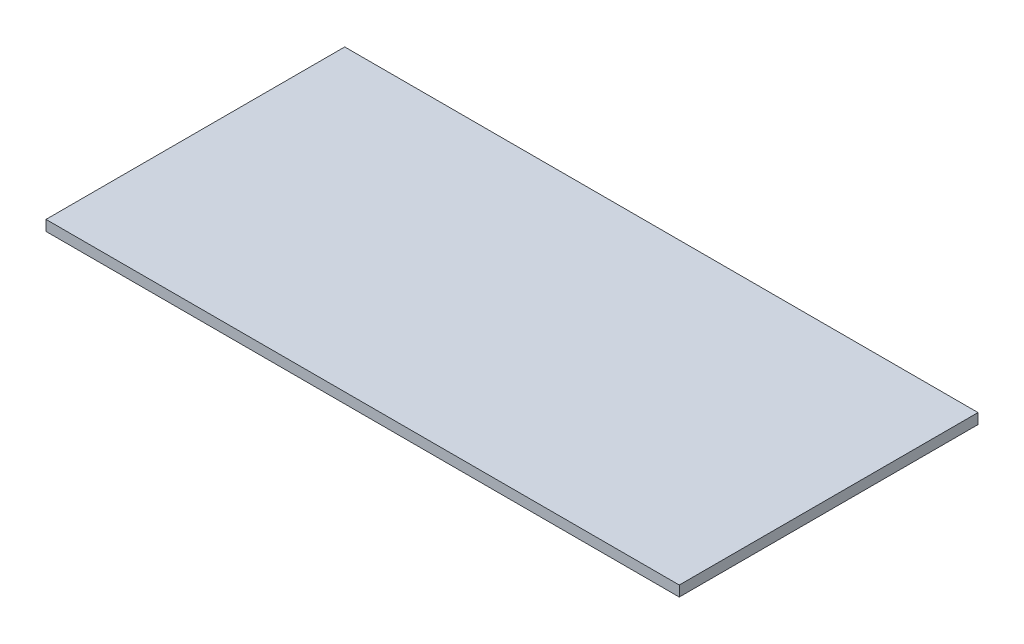
ISO-10303-21;
HEADER;
FILE_DESCRIPTION(('STEP AP214'),'2;1');
FILE_NAME('part.step','',(''),(''),'','','');
FILE_SCHEMA(('AUTOMOTIVE_DESIGN { 1 0 10303 214 1 1 1 1 }'));
ENDSEC;
DATA;
#1=APPLICATION_CONTEXT('core data for automotive mechanical design processes');
#2=APPLICATION_PROTOCOL_DEFINITION('international standard','automotive_design',2000,#1);
#3=PRODUCT_CONTEXT('',#1,'mechanical');
#4=PRODUCT('Part','Part','',(#3));
#5=PRODUCT_RELATED_PRODUCT_CATEGORY('part','',(#4));
#6=PRODUCT_DEFINITION_FORMATION('','',#4);
#7=PRODUCT_DEFINITION_CONTEXT('part definition',#1,'design');
#8=PRODUCT_DEFINITION('design','',#6,#7);
#9=PRODUCT_DEFINITION_SHAPE('','',#8);
#10=(LENGTH_UNIT() NAMED_UNIT(*) SI_UNIT(.MILLI.,.METRE.));
#11=(NAMED_UNIT(*) PLANE_ANGLE_UNIT() SI_UNIT($,.RADIAN.));
#12=(NAMED_UNIT(*) SI_UNIT($,.STERADIAN.) SOLID_ANGLE_UNIT());
#13=UNCERTAINTY_MEASURE_WITH_UNIT(LENGTH_MEASURE(1.E-05),#10,'distance_accuracy_value','');
#14=(GEOMETRIC_REPRESENTATION_CONTEXT(3) GLOBAL_UNCERTAINTY_ASSIGNED_CONTEXT((#13)) GLOBAL_UNIT_ASSIGNED_CONTEXT((#10,
#11,#12)) REPRESENTATION_CONTEXT('',''));
#15=CARTESIAN_POINT('',(0.,0.,0.));
#16=DIRECTION('',(0.,0.,1.));
#17=DIRECTION('',(1.,0.,0.));
#18=AXIS2_PLACEMENT_3D('',#15,#16,#17);
#19=CARTESIAN_POINT('',(-34.0725915138242,3.5,74.9306891112476));
#20=DIRECTION('',(1.,0.,0.));
#21=DIRECTION('',(0.,0.,-1.));
#22=AXIS2_PLACEMENT_3D('',#19,#20,#21);
#23=PLANE('',#22);
#24=DIRECTION('',(0.,0.,1.));
#25=VECTOR('',#24,1.);
#26=CARTESIAN_POINT('',(-34.0725915138242,0.,74.9306891112476));
#27=LINE('',#26,#25);
#28=CARTESIAN_POINT('',(-34.0725915138242,0.,-25.0693108887524));
#29=VERTEX_POINT('',#28);
#30=CARTESIAN_POINT('',(-34.0725915138242,0.,74.9306891112476));
#31=VERTEX_POINT('',#30);
#32=EDGE_CURVE('E111',#29,#31,#27,.T.);
#33=ORIENTED_EDGE('',*,*,#32,.T.);
#34=DIRECTION('',(0.,-1.,0.));
#35=VECTOR('',#34,1.);
#36=CARTESIAN_POINT('',(-34.0725915138242,3.5,74.9306891112476));
#37=LINE('',#36,#35);
#38=CARTESIAN_POINT('',(-34.0725915138242,3.5,74.9306891112476));
#39=VERTEX_POINT('',#38);
#40=EDGE_CURVE('E11',#39,#31,#37,.T.);
#41=ORIENTED_EDGE('',*,*,#40,.F.);
#42=DIRECTION('',(0.,0.,1.));
#43=VECTOR('',#42,1.);
#44=CARTESIAN_POINT('',(-34.0725915138242,3.5,74.9306891112476));
#45=LINE('',#44,#43);
#46=CARTESIAN_POINT('',(-34.0725915138242,3.5,-25.0693108887524));
#47=VERTEX_POINT('',#46);
#48=EDGE_CURVE('E95',#47,#39,#45,.T.);
#49=ORIENTED_EDGE('',*,*,#48,.F.);
#50=DIRECTION('',(0.,-1.,0.));
#51=VECTOR('',#50,1.);
#52=CARTESIAN_POINT('',(-34.0725915138242,3.5,-25.0693108887524));
#53=LINE('',#52,#51);
#54=EDGE_CURVE('E107',#47,#29,#53,.T.);
#55=ORIENTED_EDGE('',*,*,#54,.T.);
#56=EDGE_LOOP('',(#33,#41,#49,#55));
#57=FACE_BOUND('',#56,.T.);
#58=ADVANCED_FACE('F43',(#57),#23,.F.);
#59=CARTESIAN_POINT('',(177.927408486176,3.5,74.9306891112475));
#60=DIRECTION('',(0.,0.,-1.));
#61=DIRECTION('',(-1.,0.,0.));
#62=AXIS2_PLACEMENT_3D('',#59,#60,#61);
#63=PLANE('',#62);
#64=DIRECTION('',(1.,0.,0.));
#65=VECTOR('',#64,1.);
#66=CARTESIAN_POINT('',(177.927408486176,0.,74.9306891112475));
#67=LINE('',#66,#65);
#68=CARTESIAN_POINT('',(177.927408486176,0.,74.9306891112475));
#69=VERTEX_POINT('',#68);
#70=EDGE_CURVE('E100',#31,#69,#67,.T.);
#71=ORIENTED_EDGE('',*,*,#70,.T.);
#72=DIRECTION('',(0.,-1.,0.));
#73=VECTOR('',#72,1.);
#74=CARTESIAN_POINT('',(177.927408486176,3.5,74.9306891112475));
#75=LINE('',#74,#73);
#76=CARTESIAN_POINT('',(177.927408486176,3.5,74.9306891112475));
#77=VERTEX_POINT('',#76);
#78=EDGE_CURVE('E52',#77,#69,#75,.T.);
#79=ORIENTED_EDGE('',*,*,#78,.F.);
#80=DIRECTION('',(1.,0.,0.));
#81=VECTOR('',#80,1.);
#82=CARTESIAN_POINT('',(177.927408486176,3.5,74.9306891112475));
#83=LINE('',#82,#81);
#84=EDGE_CURVE('E90',#39,#77,#83,.T.);
#85=ORIENTED_EDGE('',*,*,#84,.F.);
#86=ORIENTED_EDGE('',*,*,#40,.T.);
#87=EDGE_LOOP('',(#71,#79,#85,#86));
#88=FACE_BOUND('',#87,.T.);
#89=ADVANCED_FACE('F99',(#88),#63,.F.);
#90=CARTESIAN_POINT('',(177.927408486176,3.5,-25.0693108887524));
#91=DIRECTION('',(-1.,0.,0.));
#92=DIRECTION('',(0.,0.,1.));
#93=AXIS2_PLACEMENT_3D('',#90,#91,#92);
#94=PLANE('',#93);
#95=DIRECTION('',(0.,0.,-1.));
#96=VECTOR('',#95,1.);
#97=CARTESIAN_POINT('',(177.927408486176,0.,-25.0693108887524));
#98=LINE('',#97,#96);
#99=CARTESIAN_POINT('',(177.927408486176,0.,-25.0693108887524));
#100=VERTEX_POINT('',#99);
#101=EDGE_CURVE('E77',#69,#100,#98,.T.);
#102=ORIENTED_EDGE('',*,*,#101,.T.);
#103=DIRECTION('',(0.,-1.,0.));
#104=VECTOR('',#103,1.);
#105=CARTESIAN_POINT('',(177.927408486176,3.5,-25.0693108887524));
#106=LINE('',#105,#104);
#107=CARTESIAN_POINT('',(177.927408486176,3.5,-25.0693108887524));
#108=VERTEX_POINT('',#107);
#109=EDGE_CURVE('E102',#108,#100,#106,.T.);
#110=ORIENTED_EDGE('',*,*,#109,.F.);
#111=DIRECTION('',(0.,0.,-1.));
#112=VECTOR('',#111,1.);
#113=CARTESIAN_POINT('',(177.927408486176,3.5,-25.0693108887524));
#114=LINE('',#113,#112);
#115=EDGE_CURVE('E93',#77,#108,#114,.T.);
#116=ORIENTED_EDGE('',*,*,#115,.F.);
#117=ORIENTED_EDGE('',*,*,#78,.T.);
#118=EDGE_LOOP('',(#102,#110,#116,#117));
#119=FACE_BOUND('',#118,.T.);
#120=ADVANCED_FACE('F103',(#119),#94,.F.);
#121=CARTESIAN_POINT('',(-34.0725915138242,3.5,-25.0693108887524));
#122=DIRECTION('',(0.,0.,1.));
#123=DIRECTION('',(1.,0.,0.));
#124=AXIS2_PLACEMENT_3D('',#121,#122,#123);
#125=PLANE('',#124);
#126=DIRECTION('',(-1.,0.,0.));
#127=VECTOR('',#126,1.);
#128=CARTESIAN_POINT('',(-34.0725915138242,0.,-25.0693108887524));
#129=LINE('',#128,#127);
#130=EDGE_CURVE('E83',#100,#29,#129,.T.);
#131=ORIENTED_EDGE('',*,*,#130,.T.);
#132=ORIENTED_EDGE('',*,*,#54,.F.);
#133=DIRECTION('',(-1.,0.,0.));
#134=VECTOR('',#133,1.);
#135=CARTESIAN_POINT('',(-34.0725915138242,3.5,-25.0693108887524));
#136=LINE('',#135,#134);
#137=EDGE_CURVE('E60',#108,#47,#136,.T.);
#138=ORIENTED_EDGE('',*,*,#137,.F.);
#139=ORIENTED_EDGE('',*,*,#109,.T.);
#140=EDGE_LOOP('',(#131,#132,#138,#139));
#141=FACE_BOUND('',#140,.T.);
#142=ADVANCED_FACE('F124',(#141),#125,.F.);
#143=CARTESIAN_POINT('',(0.,3.5,0.));
#144=DIRECTION('',(0.,-1.,0.));
#145=DIRECTION('',(0.,0.,-1.));
#146=AXIS2_PLACEMENT_3D('',#143,#144,#145);
#147=PLANE('',#146);
#148=ORIENTED_EDGE('',*,*,#48,.T.);
#149=ORIENTED_EDGE('',*,*,#84,.T.);
#150=ORIENTED_EDGE('',*,*,#115,.T.);
#151=ORIENTED_EDGE('',*,*,#137,.T.);
#152=EDGE_LOOP('',(#148,#149,#150,#151));
#153=FACE_BOUND('',#152,.T.);
#154=ADVANCED_FACE('F91',(#153),#147,.F.);
#155=CARTESIAN_POINT('',(0.,0.,0.));
#156=DIRECTION('',(0.,-1.,0.));
#157=DIRECTION('',(0.,0.,-1.));
#158=AXIS2_PLACEMENT_3D('',#155,#156,#157);
#159=PLANE('',#158);
#160=ORIENTED_EDGE('',*,*,#32,.F.);
#161=ORIENTED_EDGE('',*,*,#130,.F.);
#162=ORIENTED_EDGE('',*,*,#101,.F.);
#163=ORIENTED_EDGE('',*,*,#70,.F.);
#164=EDGE_LOOP('',(#160,#161,#162,#163));
#165=FACE_BOUND('',#164,.T.);
#166=ADVANCED_FACE('F127',(#165),#159,.T.);
#167=CLOSED_SHELL('',(#58,#89,#120,#142,#154,#166));
#168=MANIFOLD_SOLID_BREP('B2',#167);
#169=ADVANCED_BREP_SHAPE_REPRESENTATION('',(#18,#168),#14);
#170=SHAPE_DEFINITION_REPRESENTATION(#9,#169);
ENDSEC;
END-ISO-10303-21;
